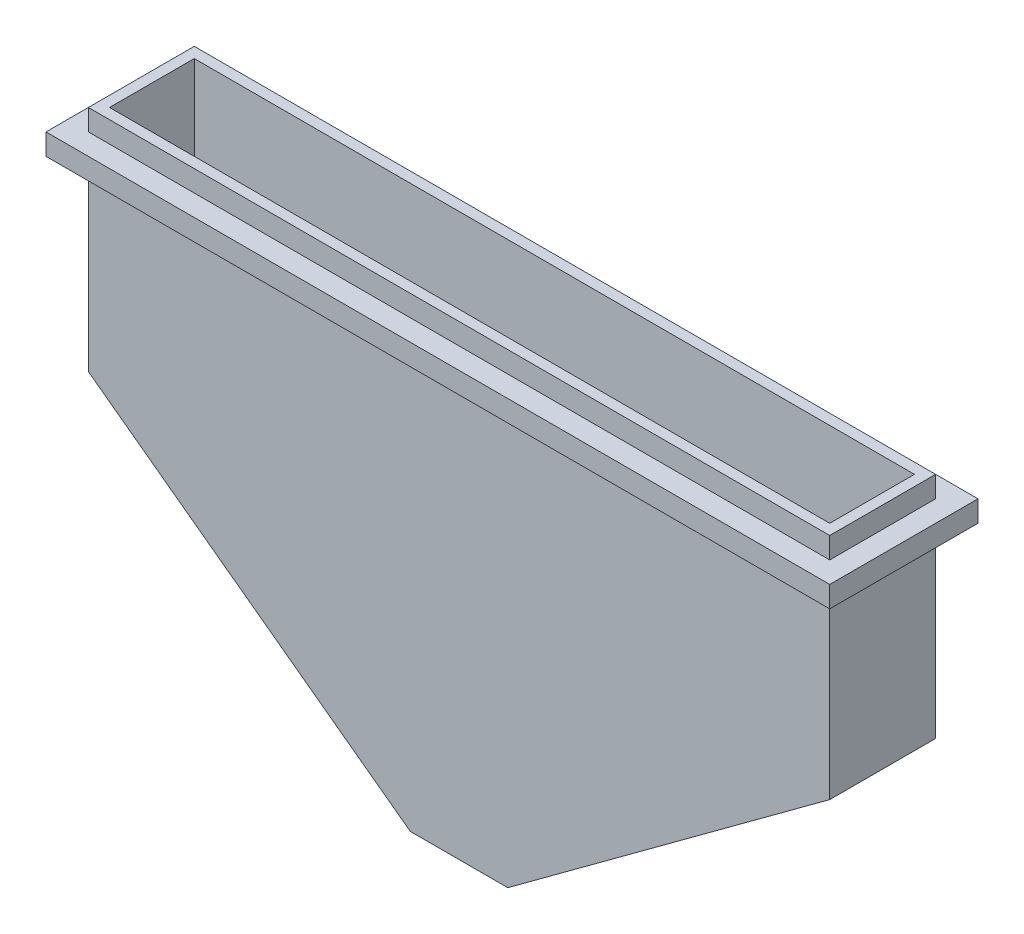
ISO-10303-21;
HEADER;
FILE_DESCRIPTION(('STEP AP214'),'2;1');
FILE_NAME('part.step','',(''),(''),'','','');
FILE_SCHEMA(('AUTOMOTIVE_DESIGN { 1 0 10303 214 1 1 1 1 }'));
ENDSEC;
DATA;
#1=APPLICATION_CONTEXT('core data for automotive mechanical design processes');
#2=APPLICATION_PROTOCOL_DEFINITION('international standard','automotive_design',2000,#1);
#3=PRODUCT_CONTEXT('',#1,'mechanical');
#4=PRODUCT('Part','Part','',(#3));
#5=PRODUCT_RELATED_PRODUCT_CATEGORY('part','',(#4));
#6=PRODUCT_DEFINITION_FORMATION('','',#4);
#7=PRODUCT_DEFINITION_CONTEXT('part definition',#1,'design');
#8=PRODUCT_DEFINITION('design','',#6,#7);
#9=PRODUCT_DEFINITION_SHAPE('','',#8);
#10=(LENGTH_UNIT() NAMED_UNIT(*) SI_UNIT(.MILLI.,.METRE.));
#11=(NAMED_UNIT(*) PLANE_ANGLE_UNIT() SI_UNIT($,.RADIAN.));
#12=(NAMED_UNIT(*) SI_UNIT($,.STERADIAN.) SOLID_ANGLE_UNIT());
#13=UNCERTAINTY_MEASURE_WITH_UNIT(LENGTH_MEASURE(1.E-05),#10,'distance_accuracy_value','');
#14=(GEOMETRIC_REPRESENTATION_CONTEXT(3) GLOBAL_UNCERTAINTY_ASSIGNED_CONTEXT((#13)) GLOBAL_UNIT_ASSIGNED_CONTEXT((#10,
#11,#12)) REPRESENTATION_CONTEXT('',''));
#15=CARTESIAN_POINT('',(0.,0.,0.));
#16=DIRECTION('',(0.,0.,1.));
#17=DIRECTION('',(1.,0.,0.));
#18=AXIS2_PLACEMENT_3D('',#15,#16,#17);
#19=CARTESIAN_POINT('',(0.,0.,0.));
#20=DIRECTION('',(0.,1.,0.));
#21=DIRECTION('',(0.,0.,1.));
#22=AXIS2_PLACEMENT_3D('',#19,#20,#21);
#23=PLANE('',#22);
#24=DIRECTION('',(0.,0.,-1.));
#25=VECTOR('',#24,1.);
#26=CARTESIAN_POINT('',(185.,0.,-35.));
#27=LINE('',#26,#25);
#28=CARTESIAN_POINT('',(185.,0.,35.));
#29=VERTEX_POINT('',#28);
#30=CARTESIAN_POINT('',(185.,0.,-35.));
#31=VERTEX_POINT('',#30);
#32=EDGE_CURVE('E277',#29,#31,#27,.T.);
#33=ORIENTED_EDGE('',*,*,#32,.F.);
#34=DIRECTION('',(1.,0.,0.));
#35=VECTOR('',#34,1.);
#36=CARTESIAN_POINT('',(-185.,0.,35.));
#37=LINE('',#36,#35);
#38=CARTESIAN_POINT('',(-185.,0.,35.));
#39=VERTEX_POINT('',#38);
#40=EDGE_CURVE('E282',#39,#29,#37,.T.);
#41=ORIENTED_EDGE('',*,*,#40,.F.);
#42=DIRECTION('',(0.,0.,1.));
#43=VECTOR('',#42,1.);
#44=CARTESIAN_POINT('',(-185.,0.,-35.));
#45=LINE('',#44,#43);
#46=CARTESIAN_POINT('',(-185.,0.,-35.));
#47=VERTEX_POINT('',#46);
#48=EDGE_CURVE('E293',#47,#39,#45,.T.);
#49=ORIENTED_EDGE('',*,*,#48,.F.);
#50=DIRECTION('',(-1.,0.,0.));
#51=VECTOR('',#50,1.);
#52=CARTESIAN_POINT('',(-185.,0.,-35.));
#53=LINE('',#52,#51);
#54=EDGE_CURVE('E291',#31,#47,#53,.T.);
#55=ORIENTED_EDGE('',*,*,#54,.F.);
#56=EDGE_LOOP('',(#33,#41,#49,#55));
#57=FACE_BOUND('',#56,.T.);
#58=DIRECTION('',(0.,0.,-1.));
#59=VECTOR('',#58,1.);
#60=CARTESIAN_POINT('',(-175.,0.,25.));
#61=LINE('',#60,#59);
#62=CARTESIAN_POINT('',(-175.,0.,25.));
#63=VERTEX_POINT('',#62);
#64=CARTESIAN_POINT('',(-175.,0.,-25.));
#65=VERTEX_POINT('',#64);
#66=EDGE_CURVE('E192',#63,#65,#61,.T.);
#67=ORIENTED_EDGE('',*,*,#66,.F.);
#68=DIRECTION('',(-1.,0.,0.));
#69=VECTOR('',#68,1.);
#70=CARTESIAN_POINT('',(175.,0.,25.));
#71=LINE('',#70,#69);
#72=CARTESIAN_POINT('',(175.,0.,25.));
#73=VERTEX_POINT('',#72);
#74=EDGE_CURVE('E223',#73,#63,#71,.T.);
#75=ORIENTED_EDGE('',*,*,#74,.F.);
#76=DIRECTION('',(0.,0.,1.));
#77=VECTOR('',#76,1.);
#78=CARTESIAN_POINT('',(175.,0.,-25.));
#79=LINE('',#78,#77);
#80=CARTESIAN_POINT('',(175.,0.,-25.));
#81=VERTEX_POINT('',#80);
#82=EDGE_CURVE('E232',#81,#73,#79,.T.);
#83=ORIENTED_EDGE('',*,*,#82,.F.);
#84=DIRECTION('',(1.,0.,0.));
#85=VECTOR('',#84,1.);
#86=CARTESIAN_POINT('',(-175.,0.,-25.));
#87=LINE('',#86,#85);
#88=EDGE_CURVE('E229',#65,#81,#87,.T.);
#89=ORIENTED_EDGE('',*,*,#88,.F.);
#90=EDGE_LOOP('',(#67,#75,#83,#89));
#91=FACE_BOUND('',#90,.T.);
#92=ADVANCED_FACE('F38',(#57,#91),#23,.F.);
#93=CARTESIAN_POINT('',(185.,10.,-35.));
#94=DIRECTION('',(-1.,0.,0.));
#95=DIRECTION('',(0.,0.,1.));
#96=AXIS2_PLACEMENT_3D('',#93,#94,#95);
#97=PLANE('',#96);
#98=ORIENTED_EDGE('',*,*,#32,.T.);
#99=DIRECTION('',(0.,-1.,0.));
#100=VECTOR('',#99,1.);
#101=CARTESIAN_POINT('',(185.,10.,-35.));
#102=LINE('',#101,#100);
#103=CARTESIAN_POINT('',(185.,10.,-35.));
#104=VERTEX_POINT('',#103);
#105=EDGE_CURVE('E304',#104,#31,#102,.T.);
#106=ORIENTED_EDGE('',*,*,#105,.F.);
#107=DIRECTION('',(0.,0.,-1.));
#108=VECTOR('',#107,1.);
#109=CARTESIAN_POINT('',(185.,10.,-35.));
#110=LINE('',#109,#108);
#111=CARTESIAN_POINT('',(185.,10.,35.));
#112=VERTEX_POINT('',#111);
#113=EDGE_CURVE('E278',#112,#104,#110,.T.);
#114=ORIENTED_EDGE('',*,*,#113,.F.);
#115=DIRECTION('',(0.,-1.,0.));
#116=VECTOR('',#115,1.);
#117=CARTESIAN_POINT('',(185.,10.,35.));
#118=LINE('',#117,#116);
#119=EDGE_CURVE('E288',#112,#29,#118,.T.);
#120=ORIENTED_EDGE('',*,*,#119,.T.);
#121=EDGE_LOOP('',(#98,#106,#114,#120));
#122=FACE_BOUND('',#121,.T.);
#123=ADVANCED_FACE('F357',(#122),#97,.F.);
#124=CARTESIAN_POINT('',(-185.,10.,-35.));
#125=DIRECTION('',(0.,0.,1.));
#126=DIRECTION('',(1.,0.,0.));
#127=AXIS2_PLACEMENT_3D('',#124,#125,#126);
#128=PLANE('',#127);
#129=ORIENTED_EDGE('',*,*,#54,.T.);
#130=DIRECTION('',(0.,-1.,0.));
#131=VECTOR('',#130,1.);
#132=CARTESIAN_POINT('',(-185.,10.,-35.));
#133=LINE('',#132,#131);
#134=CARTESIAN_POINT('',(-185.,10.,-35.));
#135=VERTEX_POINT('',#134);
#136=EDGE_CURVE('E301',#135,#47,#133,.T.);
#137=ORIENTED_EDGE('',*,*,#136,.F.);
#138=DIRECTION('',(-1.,0.,0.));
#139=VECTOR('',#138,1.);
#140=CARTESIAN_POINT('',(-185.,10.,-35.));
#141=LINE('',#140,#139);
#142=EDGE_CURVE('E281',#104,#135,#141,.T.);
#143=ORIENTED_EDGE('',*,*,#142,.F.);
#144=ORIENTED_EDGE('',*,*,#105,.T.);
#145=EDGE_LOOP('',(#129,#137,#143,#144));
#146=FACE_BOUND('',#145,.T.);
#147=ADVANCED_FACE('F363',(#146),#128,.F.);
#148=CARTESIAN_POINT('',(-185.,10.,-35.));
#149=DIRECTION('',(1.,0.,0.));
#150=DIRECTION('',(0.,0.,-1.));
#151=AXIS2_PLACEMENT_3D('',#148,#149,#150);
#152=PLANE('',#151);
#153=ORIENTED_EDGE('',*,*,#48,.T.);
#154=DIRECTION('',(0.,-1.,0.));
#155=VECTOR('',#154,1.);
#156=CARTESIAN_POINT('',(-185.,10.,35.));
#157=LINE('',#156,#155);
#158=CARTESIAN_POINT('',(-185.,10.,35.));
#159=VERTEX_POINT('',#158);
#160=EDGE_CURVE('E298',#159,#39,#157,.T.);
#161=ORIENTED_EDGE('',*,*,#160,.F.);
#162=DIRECTION('',(0.,0.,1.));
#163=VECTOR('',#162,1.);
#164=CARTESIAN_POINT('',(-185.,10.,-35.));
#165=LINE('',#164,#163);
#166=EDGE_CURVE('E284',#135,#159,#165,.T.);
#167=ORIENTED_EDGE('',*,*,#166,.F.);
#168=ORIENTED_EDGE('',*,*,#136,.T.);
#169=EDGE_LOOP('',(#153,#161,#167,#168));
#170=FACE_BOUND('',#169,.T.);
#171=ADVANCED_FACE('F374',(#170),#152,.F.);
#172=CARTESIAN_POINT('',(-185.,10.,35.));
#173=DIRECTION('',(0.,0.,-1.));
#174=DIRECTION('',(-1.,0.,0.));
#175=AXIS2_PLACEMENT_3D('',#172,#173,#174);
#176=PLANE('',#175);
#177=ORIENTED_EDGE('',*,*,#40,.T.);
#178=ORIENTED_EDGE('',*,*,#119,.F.);
#179=DIRECTION('',(1.,0.,0.));
#180=VECTOR('',#179,1.);
#181=CARTESIAN_POINT('',(-185.,10.,35.));
#182=LINE('',#181,#180);
#183=EDGE_CURVE('E286',#159,#112,#182,.T.);
#184=ORIENTED_EDGE('',*,*,#183,.F.);
#185=ORIENTED_EDGE('',*,*,#160,.T.);
#186=EDGE_LOOP('',(#177,#178,#184,#185));
#187=FACE_BOUND('',#186,.T.);
#188=ADVANCED_FACE('F371',(#187),#176,.F.);
#189=CARTESIAN_POINT('',(0.,10.,0.));
#190=DIRECTION('',(0.,1.,0.));
#191=DIRECTION('',(0.,0.,1.));
#192=AXIS2_PLACEMENT_3D('',#189,#190,#191);
#193=PLANE('',#192);
#194=DIRECTION('',(0.,0.,-1.));
#195=VECTOR('',#194,1.);
#196=CARTESIAN_POINT('',(175.,10.,-25.));
#197=LINE('',#196,#195);
#198=CARTESIAN_POINT('',(175.,10.,25.));
#199=VERTEX_POINT('',#198);
#200=CARTESIAN_POINT('',(175.,10.,-25.));
#201=VERTEX_POINT('',#200);
#202=EDGE_CURVE('E244',#199,#201,#197,.T.);
#203=ORIENTED_EDGE('',*,*,#202,.F.);
#204=DIRECTION('',(1.,0.,0.));
#205=VECTOR('',#204,1.);
#206=CARTESIAN_POINT('',(-175.,10.,25.));
#207=LINE('',#206,#205);
#208=CARTESIAN_POINT('',(-175.,10.,25.));
#209=VERTEX_POINT('',#208);
#210=EDGE_CURVE('E249',#209,#199,#207,.T.);
#211=ORIENTED_EDGE('',*,*,#210,.F.);
#212=DIRECTION('',(0.,0.,1.));
#213=VECTOR('',#212,1.);
#214=CARTESIAN_POINT('',(-175.,10.,-25.));
#215=LINE('',#214,#213);
#216=CARTESIAN_POINT('',(-175.,10.,-25.));
#217=VERTEX_POINT('',#216);
#218=EDGE_CURVE('E261',#217,#209,#215,.T.);
#219=ORIENTED_EDGE('',*,*,#218,.F.);
#220=DIRECTION('',(-1.,0.,0.));
#221=VECTOR('',#220,1.);
#222=CARTESIAN_POINT('',(-175.,10.,-25.));
#223=LINE('',#222,#221);
#224=EDGE_CURVE('E258',#201,#217,#223,.T.);
#225=ORIENTED_EDGE('',*,*,#224,.F.);
#226=EDGE_LOOP('',(#203,#211,#219,#225));
#227=FACE_BOUND('',#226,.T.);
#228=ORIENTED_EDGE('',*,*,#113,.T.);
#229=ORIENTED_EDGE('',*,*,#142,.T.);
#230=ORIENTED_EDGE('',*,*,#166,.T.);
#231=ORIENTED_EDGE('',*,*,#183,.T.);
#232=EDGE_LOOP('',(#228,#229,#230,#231));
#233=FACE_BOUND('',#232,.T.);
#234=ADVANCED_FACE('F369',(#227,#233),#193,.T.);
#235=CARTESIAN_POINT('',(175.,20.,-25.));
#236=DIRECTION('',(-1.,0.,0.));
#237=DIRECTION('',(0.,0.,1.));
#238=AXIS2_PLACEMENT_3D('',#235,#236,#237);
#239=PLANE('',#238);
#240=ORIENTED_EDGE('',*,*,#202,.T.);
#241=DIRECTION('',(0.,-1.,0.));
#242=VECTOR('',#241,1.);
#243=CARTESIAN_POINT('',(175.,20.,-25.));
#244=LINE('',#243,#242);
#245=CARTESIAN_POINT('',(175.,20.,-25.));
#246=VERTEX_POINT('',#245);
#247=EDGE_CURVE('E274',#246,#201,#244,.T.);
#248=ORIENTED_EDGE('',*,*,#247,.F.);
#249=DIRECTION('',(0.,0.,-1.));
#250=VECTOR('',#249,1.);
#251=CARTESIAN_POINT('',(175.,20.,-25.));
#252=LINE('',#251,#250);
#253=CARTESIAN_POINT('',(175.,20.,25.));
#254=VERTEX_POINT('',#253);
#255=EDGE_CURVE('E245',#254,#246,#252,.T.);
#256=ORIENTED_EDGE('',*,*,#255,.F.);
#257=DIRECTION('',(0.,-1.,0.));
#258=VECTOR('',#257,1.);
#259=CARTESIAN_POINT('',(175.,20.,25.));
#260=LINE('',#259,#258);
#261=EDGE_CURVE('E255',#254,#199,#260,.T.);
#262=ORIENTED_EDGE('',*,*,#261,.T.);
#263=EDGE_LOOP('',(#240,#248,#256,#262));
#264=FACE_BOUND('',#263,.T.);
#265=ADVANCED_FACE('F399',(#264),#239,.F.);
#266=CARTESIAN_POINT('',(-175.,20.,-25.));
#267=DIRECTION('',(0.,0.,1.));
#268=DIRECTION('',(1.,0.,0.));
#269=AXIS2_PLACEMENT_3D('',#266,#267,#268);
#270=PLANE('',#269);
#271=ORIENTED_EDGE('',*,*,#224,.T.);
#272=DIRECTION('',(0.,-1.,0.));
#273=VECTOR('',#272,1.);
#274=CARTESIAN_POINT('',(-175.,20.,-25.));
#275=LINE('',#274,#273);
#276=CARTESIAN_POINT('',(-175.,20.,-25.));
#277=VERTEX_POINT('',#276);
#278=EDGE_CURVE('E271',#277,#217,#275,.T.);
#279=ORIENTED_EDGE('',*,*,#278,.F.);
#280=DIRECTION('',(-1.,0.,0.));
#281=VECTOR('',#280,1.);
#282=CARTESIAN_POINT('',(-175.,20.,-25.));
#283=LINE('',#282,#281);
#284=EDGE_CURVE('E248',#246,#277,#283,.T.);
#285=ORIENTED_EDGE('',*,*,#284,.F.);
#286=ORIENTED_EDGE('',*,*,#247,.T.);
#287=EDGE_LOOP('',(#271,#279,#285,#286));
#288=FACE_BOUND('',#287,.T.);
#289=ADVANCED_FACE('F404',(#288),#270,.F.);
#290=CARTESIAN_POINT('',(-175.,20.,-25.));
#291=DIRECTION('',(1.,0.,0.));
#292=DIRECTION('',(0.,0.,-1.));
#293=AXIS2_PLACEMENT_3D('',#290,#291,#292);
#294=PLANE('',#293);
#295=ORIENTED_EDGE('',*,*,#218,.T.);
#296=DIRECTION('',(0.,-1.,0.));
#297=VECTOR('',#296,1.);
#298=CARTESIAN_POINT('',(-175.,20.,25.));
#299=LINE('',#298,#297);
#300=CARTESIAN_POINT('',(-175.,20.,25.));
#301=VERTEX_POINT('',#300);
#302=EDGE_CURVE('E268',#301,#209,#299,.T.);
#303=ORIENTED_EDGE('',*,*,#302,.F.);
#304=DIRECTION('',(0.,0.,1.));
#305=VECTOR('',#304,1.);
#306=CARTESIAN_POINT('',(-175.,20.,-25.));
#307=LINE('',#306,#305);
#308=EDGE_CURVE('E251',#277,#301,#307,.T.);
#309=ORIENTED_EDGE('',*,*,#308,.F.);
#310=ORIENTED_EDGE('',*,*,#278,.T.);
#311=EDGE_LOOP('',(#295,#303,#309,#310));
#312=FACE_BOUND('',#311,.T.);
#313=ADVANCED_FACE('F418',(#312),#294,.F.);
#314=CARTESIAN_POINT('',(-175.,20.,25.));
#315=DIRECTION('',(0.,0.,-1.));
#316=DIRECTION('',(-1.,0.,0.));
#317=AXIS2_PLACEMENT_3D('',#314,#315,#316);
#318=PLANE('',#317);
#319=ORIENTED_EDGE('',*,*,#210,.T.);
#320=ORIENTED_EDGE('',*,*,#261,.F.);
#321=DIRECTION('',(1.,0.,0.));
#322=VECTOR('',#321,1.);
#323=CARTESIAN_POINT('',(-175.,20.,25.));
#324=LINE('',#323,#322);
#325=EDGE_CURVE('E253',#301,#254,#324,.T.);
#326=ORIENTED_EDGE('',*,*,#325,.F.);
#327=ORIENTED_EDGE('',*,*,#302,.T.);
#328=EDGE_LOOP('',(#319,#320,#326,#327));
#329=FACE_BOUND('',#328,.T.);
#330=ADVANCED_FACE('F409',(#329),#318,.F.);
#331=CARTESIAN_POINT('',(0.,20.,0.));
#332=DIRECTION('',(0.,1.,0.));
#333=DIRECTION('',(0.,0.,1.));
#334=AXIS2_PLACEMENT_3D('',#331,#332,#333);
#335=PLANE('',#334);
#336=DIRECTION('',(0.,0.,-1.));
#337=VECTOR('',#336,1.);
#338=CARTESIAN_POINT('',(170.,20.,-25.));
#339=LINE('',#338,#337);
#340=CARTESIAN_POINT('',(170.,20.,20.));
#341=VERTEX_POINT('',#340);
#342=CARTESIAN_POINT('',(170.,20.,-20.));
#343=VERTEX_POINT('',#342);
#344=EDGE_CURVE('E212',#341,#343,#339,.T.);
#345=ORIENTED_EDGE('',*,*,#344,.F.);
#346=DIRECTION('',(1.,0.,0.));
#347=VECTOR('',#346,1.);
#348=CARTESIAN_POINT('',(-175.,20.,20.));
#349=LINE('',#348,#347);
#350=CARTESIAN_POINT('',(-170.,20.,20.));
#351=VERTEX_POINT('',#350);
#352=EDGE_CURVE('E217',#351,#341,#349,.T.);
#353=ORIENTED_EDGE('',*,*,#352,.F.);
#354=DIRECTION('',(0.,0.,1.));
#355=VECTOR('',#354,1.);
#356=CARTESIAN_POINT('',(-170.,20.,-25.));
#357=LINE('',#356,#355);
#358=CARTESIAN_POINT('',(-170.,20.,-20.));
#359=VERTEX_POINT('',#358);
#360=EDGE_CURVE('E180',#359,#351,#357,.T.);
#361=ORIENTED_EDGE('',*,*,#360,.F.);
#362=DIRECTION('',(-1.,0.,0.));
#363=VECTOR('',#362,1.);
#364=CARTESIAN_POINT('',(-175.,20.,-20.));
#365=LINE('',#364,#363);
#366=EDGE_CURVE('E214',#343,#359,#365,.T.);
#367=ORIENTED_EDGE('',*,*,#366,.F.);
#368=EDGE_LOOP('',(#345,#353,#361,#367));
#369=FACE_BOUND('',#368,.T.);
#370=ORIENTED_EDGE('',*,*,#255,.T.);
#371=ORIENTED_EDGE('',*,*,#284,.T.);
#372=ORIENTED_EDGE('',*,*,#308,.T.);
#373=ORIENTED_EDGE('',*,*,#325,.T.);
#374=EDGE_LOOP('',(#370,#371,#372,#373));
#375=FACE_BOUND('',#374,.T.);
#376=ADVANCED_FACE('F414',(#369,#375),#335,.T.);
#377=CARTESIAN_POINT('',(-175.,-200.,25.));
#378=DIRECTION('',(1.,0.,0.));
#379=DIRECTION('',(0.,0.,-1.));
#380=AXIS2_PLACEMENT_3D('',#377,#378,#379);
#381=PLANE('',#380);
#382=DIRECTION('',(0.,1.,0.));
#383=VECTOR('',#382,1.);
#384=CARTESIAN_POINT('',(-175.,-200.,-25.));
#385=LINE('',#384,#383);
#386=CARTESIAN_POINT('',(-175.,-87.9999999999997,-25.));
#387=VERTEX_POINT('',#386);
#388=EDGE_CURVE('E242',#387,#65,#385,.T.);
#389=ORIENTED_EDGE('',*,*,#388,.F.);
#390=DIRECTION('',(0.,0.,1.));
#391=VECTOR('',#390,1.);
#392=CARTESIAN_POINT('',(-175.,-87.9999999999997,25.));
#393=LINE('',#392,#391);
#394=CARTESIAN_POINT('',(-175.,-87.9999999999997,25.));
#395=VERTEX_POINT('',#394);
#396=EDGE_CURVE('E11',#387,#395,#393,.T.);
#397=ORIENTED_EDGE('',*,*,#396,.T.);
#398=DIRECTION('',(0.,1.,0.));
#399=VECTOR('',#398,1.);
#400=CARTESIAN_POINT('',(-175.,-200.,25.));
#401=LINE('',#400,#399);
#402=EDGE_CURVE('E226',#395,#63,#401,.T.);
#403=ORIENTED_EDGE('',*,*,#402,.T.);
#404=ORIENTED_EDGE('',*,*,#66,.T.);
#405=EDGE_LOOP('',(#389,#397,#403,#404));
#406=FACE_BOUND('',#405,.T.);
#407=ADVANCED_FACE('F343',(#406),#381,.F.);
#408=CARTESIAN_POINT('',(-175.,-200.,-25.));
#409=DIRECTION('',(0.,0.,1.));
#410=DIRECTION('',(1.,0.,0.));
#411=AXIS2_PLACEMENT_3D('',#408,#409,#410);
#412=PLANE('',#411);
#413=DIRECTION('',(0.,1.,0.));
#414=VECTOR('',#413,1.);
#415=CARTESIAN_POINT('',(175.,-200.,-25.));
#416=LINE('',#415,#414);
#417=CARTESIAN_POINT('',(175.,-87.9999999999997,-25.));
#418=VERTEX_POINT('',#417);
#419=EDGE_CURVE('E240',#418,#81,#416,.T.);
#420=ORIENTED_EDGE('',*,*,#419,.F.);
#421=DIRECTION('',(-0.805055837353368,-0.593199038049849,0.));
#422=VECTOR('',#421,1.);
#423=CARTESIAN_POINT('',(22.9999999999994,-200.,-25.));
#424=LINE('',#423,#422);
#425=CARTESIAN_POINT('',(22.9999999999994,-200.,-25.));
#426=VERTEX_POINT('',#425);
#427=EDGE_CURVE('E48',#418,#426,#424,.T.);
#428=ORIENTED_EDGE('',*,*,#427,.T.);
#429=DIRECTION('',(1.,0.,0.));
#430=VECTOR('',#429,1.);
#431=CARTESIAN_POINT('',(-175.,-200.,-25.));
#432=LINE('',#431,#430);
#433=CARTESIAN_POINT('',(-22.9999999999994,-200.,-25.));
#434=VERTEX_POINT('',#433);
#435=EDGE_CURVE('E219',#434,#426,#432,.T.);
#436=ORIENTED_EDGE('',*,*,#435,.F.);
#437=DIRECTION('',(-0.805055837353368,0.593199038049849,0.));
#438=VECTOR('',#437,1.);
#439=CARTESIAN_POINT('',(-22.9999999999994,-200.,-25.));
#440=LINE('',#439,#438);
#441=EDGE_CURVE('E63',#434,#387,#440,.T.);
#442=ORIENTED_EDGE('',*,*,#441,.T.);
#443=ORIENTED_EDGE('',*,*,#388,.T.);
#444=ORIENTED_EDGE('',*,*,#88,.T.);
#445=EDGE_LOOP('',(#420,#428,#436,#442,#443,#444));
#446=FACE_BOUND('',#445,.T.);
#447=ADVANCED_FACE('F322',(#446),#412,.F.);
#448=CARTESIAN_POINT('',(175.,-200.,-25.));
#449=DIRECTION('',(-1.,0.,0.));
#450=DIRECTION('',(0.,0.,1.));
#451=AXIS2_PLACEMENT_3D('',#448,#449,#450);
#452=PLANE('',#451);
#453=DIRECTION('',(0.,1.,0.));
#454=VECTOR('',#453,1.);
#455=CARTESIAN_POINT('',(175.,-200.,25.));
#456=LINE('',#455,#454);
#457=CARTESIAN_POINT('',(175.,-87.9999999999997,25.));
#458=VERTEX_POINT('',#457);
#459=EDGE_CURVE('E238',#458,#73,#456,.T.);
#460=ORIENTED_EDGE('',*,*,#459,.F.);
#461=DIRECTION('',(0.,0.,-1.));
#462=VECTOR('',#461,1.);
#463=CARTESIAN_POINT('',(175.,-87.9999999999997,-25.));
#464=LINE('',#463,#462);
#465=EDGE_CURVE('E317',#458,#418,#464,.T.);
#466=ORIENTED_EDGE('',*,*,#465,.T.);
#467=ORIENTED_EDGE('',*,*,#419,.T.);
#468=ORIENTED_EDGE('',*,*,#82,.T.);
#469=EDGE_LOOP('',(#460,#466,#467,#468));
#470=FACE_BOUND('',#469,.T.);
#471=ADVANCED_FACE('F336',(#470),#452,.F.);
#472=CARTESIAN_POINT('',(175.,-200.,25.));
#473=DIRECTION('',(0.,0.,-1.));
#474=DIRECTION('',(-1.,0.,0.));
#475=AXIS2_PLACEMENT_3D('',#472,#473,#474);
#476=PLANE('',#475);
#477=DIRECTION('',(-1.,0.,0.));
#478=VECTOR('',#477,1.);
#479=CARTESIAN_POINT('',(175.,-200.,25.));
#480=LINE('',#479,#478);
#481=CARTESIAN_POINT('',(22.9999999999994,-200.,25.));
#482=VERTEX_POINT('',#481);
#483=CARTESIAN_POINT('',(-22.9999999999994,-200.,25.));
#484=VERTEX_POINT('',#483);
#485=EDGE_CURVE('E222',#482,#484,#480,.T.);
#486=ORIENTED_EDGE('',*,*,#485,.F.);
#487=DIRECTION('',(0.805055837353368,0.593199038049849,0.));
#488=VECTOR('',#487,1.);
#489=CARTESIAN_POINT('',(22.9999999999994,-200.,25.));
#490=LINE('',#489,#488);
#491=EDGE_CURVE('E315',#482,#458,#490,.T.);
#492=ORIENTED_EDGE('',*,*,#491,.T.);
#493=ORIENTED_EDGE('',*,*,#459,.T.);
#494=ORIENTED_EDGE('',*,*,#74,.T.);
#495=ORIENTED_EDGE('',*,*,#402,.F.);
#496=DIRECTION('',(0.805055837353368,-0.593199038049849,0.));
#497=VECTOR('',#496,1.);
#498=CARTESIAN_POINT('',(-22.9999999999994,-200.,25.));
#499=LINE('',#498,#497);
#500=EDGE_CURVE('E313',#395,#484,#499,.T.);
#501=ORIENTED_EDGE('',*,*,#500,.T.);
#502=EDGE_LOOP('',(#486,#492,#493,#494,#495,#501));
#503=FACE_BOUND('',#502,.T.);
#504=ADVANCED_FACE('F333',(#503),#476,.F.);
#505=CARTESIAN_POINT('',(0.,-200.,0.));
#506=DIRECTION('',(0.,-1.,0.));
#507=DIRECTION('',(0.,0.,-1.));
#508=AXIS2_PLACEMENT_3D('',#505,#506,#507);
#509=PLANE('',#508);
#510=CARTESIAN_POINT('',(0.,-200.,0.));
#511=DIRECTION('',(0.,-1.,0.));
#512=DIRECTION('',(0.,0.,-1.));
#513=AXIS2_PLACEMENT_3D('',#510,#511,#512);
#514=CIRCLE('',#513,12.5);
#515=CARTESIAN_POINT('',(0.,-200.,-12.5));
#516=VERTEX_POINT('',#515);
#517=EDGE_CURVE('E468',#516,#516,#514,.T.);
#518=ORIENTED_EDGE('',*,*,#517,.F.);
#519=EDGE_LOOP('',(#518));
#520=FACE_BOUND('',#519,.T.);
#521=ORIENTED_EDGE('',*,*,#435,.T.);
#522=DIRECTION('',(0.,0.,1.));
#523=VECTOR('',#522,1.);
#524=CARTESIAN_POINT('',(22.9999999999994,-200.,25.));
#525=LINE('',#524,#523);
#526=EDGE_CURVE('E310',#426,#482,#525,.T.);
#527=ORIENTED_EDGE('',*,*,#526,.T.);
#528=ORIENTED_EDGE('',*,*,#485,.T.);
#529=DIRECTION('',(0.,0.,-1.));
#530=VECTOR('',#529,1.);
#531=CARTESIAN_POINT('',(-22.9999999999994,-200.,-25.));
#532=LINE('',#531,#530);
#533=EDGE_CURVE('E307',#484,#434,#532,.T.);
#534=ORIENTED_EDGE('',*,*,#533,.T.);
#535=EDGE_LOOP('',(#521,#527,#528,#534));
#536=FACE_BOUND('',#535,.T.);
#537=ADVANCED_FACE('F327',(#520,#536),#509,.T.);
#538=CARTESIAN_POINT('',(22.9999999999994,-200.,0.));
#539=DIRECTION('',(0.593199038049849,-0.805055837353368,0.));
#540=DIRECTION('',(0.,0.,-1.));
#541=AXIS2_PLACEMENT_3D('',#538,#539,#540);
#542=PLANE('',#541);
#543=ORIENTED_EDGE('',*,*,#427,.F.);
#544=ORIENTED_EDGE('',*,*,#465,.F.);
#545=ORIENTED_EDGE('',*,*,#491,.F.);
#546=ORIENTED_EDGE('',*,*,#526,.F.);
#547=EDGE_LOOP('',(#543,#544,#545,#546));
#548=FACE_BOUND('',#547,.T.);
#549=ADVANCED_FACE('F330',(#548),#542,.T.);
#550=CARTESIAN_POINT('',(-22.9999999999994,-200.,0.));
#551=DIRECTION('',(-0.593199038049849,-0.805055837353368,0.));
#552=DIRECTION('',(0.,0.,1.));
#553=AXIS2_PLACEMENT_3D('',#550,#551,#552);
#554=PLANE('',#553);
#555=ORIENTED_EDGE('',*,*,#500,.F.);
#556=ORIENTED_EDGE('',*,*,#396,.F.);
#557=ORIENTED_EDGE('',*,*,#441,.F.);
#558=ORIENTED_EDGE('',*,*,#533,.F.);
#559=EDGE_LOOP('',(#555,#556,#557,#558));
#560=FACE_BOUND('',#559,.T.);
#561=ADVANCED_FACE('F41',(#560),#554,.T.);
#562=CARTESIAN_POINT('',(170.,20.,-25.));
#563=DIRECTION('',(-1.,0.,0.));
#564=DIRECTION('',(0.,0.,1.));
#565=AXIS2_PLACEMENT_3D('',#562,#563,#564);
#566=PLANE('',#565);
#567=DIRECTION('',(0.,-1.,0.));
#568=VECTOR('',#567,1.);
#569=CARTESIAN_POINT('',(170.,20.,20.));
#570=LINE('',#569,#568);
#571=CARTESIAN_POINT('',(170.,-85.473461199365,20.));
#572=VERTEX_POINT('',#571);
#573=EDGE_CURVE('E183',#341,#572,#570,.T.);
#574=ORIENTED_EDGE('',*,*,#573,.F.);
#575=ORIENTED_EDGE('',*,*,#344,.T.);
#576=DIRECTION('',(0.,-1.,0.));
#577=VECTOR('',#576,1.);
#578=CARTESIAN_POINT('',(170.,20.,-20.));
#579=LINE('',#578,#577);
#580=CARTESIAN_POINT('',(170.,-85.473461199365,-20.));
#581=VERTEX_POINT('',#580);
#582=EDGE_CURVE('E211',#343,#581,#579,.T.);
#583=ORIENTED_EDGE('',*,*,#582,.T.);
#584=DIRECTION('',(0.,0.,-1.));
#585=VECTOR('',#584,1.);
#586=CARTESIAN_POINT('',(170.,-85.473461199365,0.));
#587=LINE('',#586,#585);
#588=EDGE_CURVE('E203',#572,#581,#587,.T.);
#589=ORIENTED_EDGE('',*,*,#588,.F.);
#590=EDGE_LOOP('',(#574,#575,#583,#589));
#591=FACE_BOUND('',#590,.T.);
#592=ADVANCED_FACE('F348',(#591),#566,.T.);
#593=CARTESIAN_POINT('',(-175.,20.,-20.));
#594=DIRECTION('',(0.,0.,1.));
#595=DIRECTION('',(1.,0.,0.));
#596=AXIS2_PLACEMENT_3D('',#593,#594,#595);
#597=PLANE('',#596);
#598=ORIENTED_EDGE('',*,*,#582,.F.);
#599=ORIENTED_EDGE('',*,*,#366,.T.);
#600=DIRECTION('',(0.,-1.,0.));
#601=VECTOR('',#600,1.);
#602=CARTESIAN_POINT('',(-170.,20.,-20.));
#603=LINE('',#602,#601);
#604=CARTESIAN_POINT('',(-170.,-85.473461199365,-20.));
#605=VERTEX_POINT('',#604);
#606=EDGE_CURVE('E182',#359,#605,#603,.T.);
#607=ORIENTED_EDGE('',*,*,#606,.T.);
#608=DIRECTION('',(-0.805055837353368,0.593199038049849,0.));
#609=VECTOR('',#608,1.);
#610=CARTESIAN_POINT('',(-20.0340048097501,-195.974720813233,-20.));
#611=LINE('',#610,#609);
#612=CARTESIAN_POINT('',(-21.356840199138,-195.,-20.));
#613=VERTEX_POINT('',#612);
#614=EDGE_CURVE('E191',#613,#605,#611,.T.);
#615=ORIENTED_EDGE('',*,*,#614,.F.);
#616=DIRECTION('',(1.,0.,0.));
#617=VECTOR('',#616,1.);
#618=CARTESIAN_POINT('',(-175.,-195.,-20.));
#619=LINE('',#618,#617);
#620=CARTESIAN_POINT('',(21.356840199138,-195.,-20.));
#621=VERTEX_POINT('',#620);
#622=EDGE_CURVE('E471',#613,#621,#619,.T.);
#623=ORIENTED_EDGE('',*,*,#622,.T.);
#624=DIRECTION('',(-0.805055837353368,-0.593199038049849,0.));
#625=VECTOR('',#624,1.);
#626=CARTESIAN_POINT('',(20.0340048097501,-195.974720813233,-20.));
#627=LINE('',#626,#625);
#628=EDGE_CURVE('E193',#581,#621,#627,.T.);
#629=ORIENTED_EDGE('',*,*,#628,.F.);
#630=EDGE_LOOP('',(#598,#599,#607,#615,#623,#629));
#631=FACE_BOUND('',#630,.T.);
#632=ADVANCED_FACE('F353',(#631),#597,.T.);
#633=CARTESIAN_POINT('',(-170.,20.,-25.));
#634=DIRECTION('',(1.,0.,0.));
#635=DIRECTION('',(0.,0.,-1.));
#636=AXIS2_PLACEMENT_3D('',#633,#634,#635);
#637=PLANE('',#636);
#638=ORIENTED_EDGE('',*,*,#606,.F.);
#639=ORIENTED_EDGE('',*,*,#360,.T.);
#640=DIRECTION('',(0.,-1.,0.));
#641=VECTOR('',#640,1.);
#642=CARTESIAN_POINT('',(-170.,20.,20.));
#643=LINE('',#642,#641);
#644=CARTESIAN_POINT('',(-170.,-85.473461199365,20.));
#645=VERTEX_POINT('',#644);
#646=EDGE_CURVE('E55',#351,#645,#643,.T.);
#647=ORIENTED_EDGE('',*,*,#646,.T.);
#648=DIRECTION('',(0.,0.,1.));
#649=VECTOR('',#648,1.);
#650=CARTESIAN_POINT('',(-170.,-85.473461199365,0.));
#651=LINE('',#650,#649);
#652=EDGE_CURVE('E178',#605,#645,#651,.T.);
#653=ORIENTED_EDGE('',*,*,#652,.F.);
#654=EDGE_LOOP('',(#638,#639,#647,#653));
#655=FACE_BOUND('',#654,.T.);
#656=ADVANCED_FACE('F177',(#655),#637,.T.);
#657=CARTESIAN_POINT('',(-175.,20.,20.));
#658=DIRECTION('',(0.,0.,-1.));
#659=DIRECTION('',(-1.,0.,0.));
#660=AXIS2_PLACEMENT_3D('',#657,#658,#659);
#661=PLANE('',#660);
#662=ORIENTED_EDGE('',*,*,#646,.F.);
#663=ORIENTED_EDGE('',*,*,#352,.T.);
#664=ORIENTED_EDGE('',*,*,#573,.T.);
#665=DIRECTION('',(0.805055837353368,0.593199038049849,0.));
#666=VECTOR('',#665,1.);
#667=CARTESIAN_POINT('',(20.0340048097501,-195.974720813233,20.));
#668=LINE('',#667,#666);
#669=CARTESIAN_POINT('',(21.356840199138,-195.,20.));
#670=VERTEX_POINT('',#669);
#671=EDGE_CURVE('E199',#670,#572,#668,.T.);
#672=ORIENTED_EDGE('',*,*,#671,.F.);
#673=DIRECTION('',(-1.,0.,0.));
#674=VECTOR('',#673,1.);
#675=CARTESIAN_POINT('',(175.,-195.,20.));
#676=LINE('',#675,#674);
#677=CARTESIAN_POINT('',(-21.356840199138,-195.,20.));
#678=VERTEX_POINT('',#677);
#679=EDGE_CURVE('E197',#670,#678,#676,.T.);
#680=ORIENTED_EDGE('',*,*,#679,.T.);
#681=DIRECTION('',(0.805055837353368,-0.593199038049849,0.));
#682=VECTOR('',#681,1.);
#683=CARTESIAN_POINT('',(-20.0340048097501,-195.974720813233,20.));
#684=LINE('',#683,#682);
#685=EDGE_CURVE('E189',#645,#678,#684,.T.);
#686=ORIENTED_EDGE('',*,*,#685,.F.);
#687=EDGE_LOOP('',(#662,#663,#664,#672,#680,#686));
#688=FACE_BOUND('',#687,.T.);
#689=ADVANCED_FACE('F195',(#688),#661,.T.);
#690=CARTESIAN_POINT('',(0.,-195.,0.));
#691=DIRECTION('',(0.,-1.,0.));
#692=DIRECTION('',(0.,0.,-1.));
#693=AXIS2_PLACEMENT_3D('',#690,#691,#692);
#694=PLANE('',#693);
#695=CARTESIAN_POINT('',(0.,-195.,0.));
#696=DIRECTION('',(0.,-1.,0.));
#697=DIRECTION('',(0.,0.,-1.));
#698=AXIS2_PLACEMENT_3D('',#695,#696,#697);
#699=CIRCLE('',#698,12.5);
#700=CARTESIAN_POINT('',(0.,-195.,-12.5));
#701=VERTEX_POINT('',#700);
#702=EDGE_CURVE('E43',#701,#701,#699,.T.);
#703=ORIENTED_EDGE('',*,*,#702,.T.);
#704=EDGE_LOOP('',(#703));
#705=FACE_BOUND('',#704,.T.);
#706=ORIENTED_EDGE('',*,*,#622,.F.);
#707=DIRECTION('',(0.,0.,-1.));
#708=VECTOR('',#707,1.);
#709=CARTESIAN_POINT('',(-21.356840199138,-195.,0.));
#710=LINE('',#709,#708);
#711=EDGE_CURVE('E206',#678,#613,#710,.T.);
#712=ORIENTED_EDGE('',*,*,#711,.F.);
#713=ORIENTED_EDGE('',*,*,#679,.F.);
#714=DIRECTION('',(0.,0.,1.));
#715=VECTOR('',#714,1.);
#716=CARTESIAN_POINT('',(21.356840199138,-195.,0.));
#717=LINE('',#716,#715);
#718=EDGE_CURVE('E200',#621,#670,#717,.T.);
#719=ORIENTED_EDGE('',*,*,#718,.F.);
#720=EDGE_LOOP('',(#706,#712,#713,#719));
#721=FACE_BOUND('',#720,.T.);
#722=ADVANCED_FACE('F449',(#705,#721),#694,.F.);
#723=CARTESIAN_POINT('',(20.0340048097501,-195.974720813233,0.));
#724=DIRECTION('',(0.593199038049849,-0.805055837353368,0.));
#725=DIRECTION('',(0.,0.,-1.));
#726=AXIS2_PLACEMENT_3D('',#723,#724,#725);
#727=PLANE('',#726);
#728=ORIENTED_EDGE('',*,*,#628,.T.);
#729=ORIENTED_EDGE('',*,*,#718,.T.);
#730=ORIENTED_EDGE('',*,*,#671,.T.);
#731=ORIENTED_EDGE('',*,*,#588,.T.);
#732=EDGE_LOOP('',(#728,#729,#730,#731));
#733=FACE_BOUND('',#732,.T.);
#734=ADVANCED_FACE('F446',(#733),#727,.F.);
#735=CARTESIAN_POINT('',(-20.0340048097501,-195.974720813233,0.));
#736=DIRECTION('',(-0.593199038049849,-0.805055837353368,0.));
#737=DIRECTION('',(0.,0.,1.));
#738=AXIS2_PLACEMENT_3D('',#735,#736,#737);
#739=PLANE('',#738);
#740=ORIENTED_EDGE('',*,*,#685,.T.);
#741=ORIENTED_EDGE('',*,*,#711,.T.);
#742=ORIENTED_EDGE('',*,*,#614,.T.);
#743=ORIENTED_EDGE('',*,*,#652,.T.);
#744=EDGE_LOOP('',(#740,#741,#742,#743));
#745=FACE_BOUND('',#744,.T.);
#746=ADVANCED_FACE('F187',(#745),#739,.F.);
#747=CARTESIAN_POINT('',(0.,-170.,0.));
#748=DIRECTION('',(0.,-1.,0.));
#749=DIRECTION('',(0.,0.,-1.));
#750=AXIS2_PLACEMENT_3D('',#747,#748,#749);
#751=CYLINDRICAL_SURFACE('',#750,12.5);
#752=CARTESIAN_POINT('',(0.,-200.,-12.5));
#753=CARTESIAN_POINT('',(0.,-199.947916666667,-12.5));
#754=CARTESIAN_POINT('',(0.,-199.895833333333,-12.5));
#755=CARTESIAN_POINT('',(0.,-199.791666666667,-12.5));
#756=CARTESIAN_POINT('',(0.,-199.739583333333,-12.5));
#757=CARTESIAN_POINT('',(0.,-199.635416666667,-12.5));
#758=CARTESIAN_POINT('',(0.,-199.583333333333,-12.5));
#759=CARTESIAN_POINT('',(0.,-199.479166666667,-12.5));
#760=CARTESIAN_POINT('',(0.,-199.427083333333,-12.5));
#761=CARTESIAN_POINT('',(0.,-199.322916666667,-12.5));
#762=CARTESIAN_POINT('',(0.,-199.270833333333,-12.5));
#763=CARTESIAN_POINT('',(0.,-199.166666666667,-12.5));
#764=CARTESIAN_POINT('',(0.,-199.114583333333,-12.5));
#765=CARTESIAN_POINT('',(0.,-199.010416666667,-12.5));
#766=CARTESIAN_POINT('',(0.,-198.958333333333,-12.5));
#767=CARTESIAN_POINT('',(0.,-198.854166666667,-12.5));
#768=CARTESIAN_POINT('',(0.,-198.802083333333,-12.5));
#769=CARTESIAN_POINT('',(0.,-198.697916666667,-12.5));
#770=CARTESIAN_POINT('',(0.,-198.645833333333,-12.5));
#771=CARTESIAN_POINT('',(0.,-198.541666666667,-12.5));
#772=CARTESIAN_POINT('',(0.,-198.489583333333,-12.5));
#773=CARTESIAN_POINT('',(0.,-198.385416666667,-12.5));
#774=CARTESIAN_POINT('',(0.,-198.333333333333,-12.5));
#775=CARTESIAN_POINT('',(0.,-198.229166666667,-12.5));
#776=CARTESIAN_POINT('',(0.,-198.177083333333,-12.5));
#777=CARTESIAN_POINT('',(0.,-198.072916666667,-12.5));
#778=CARTESIAN_POINT('',(0.,-198.020833333333,-12.5));
#779=CARTESIAN_POINT('',(0.,-197.916666666667,-12.5));
#780=CARTESIAN_POINT('',(0.,-197.864583333333,-12.5));
#781=CARTESIAN_POINT('',(0.,-197.760416666667,-12.5));
#782=CARTESIAN_POINT('',(0.,-197.708333333333,-12.5));
#783=CARTESIAN_POINT('',(0.,-197.604166666667,-12.5));
#784=CARTESIAN_POINT('',(0.,-197.552083333333,-12.5));
#785=CARTESIAN_POINT('',(0.,-197.447916666667,-12.5));
#786=CARTESIAN_POINT('',(0.,-197.395833333333,-12.5));
#787=CARTESIAN_POINT('',(0.,-197.291666666667,-12.5));
#788=CARTESIAN_POINT('',(0.,-197.239583333333,-12.5));
#789=CARTESIAN_POINT('',(0.,-197.135416666667,-12.5));
#790=CARTESIAN_POINT('',(0.,-197.083333333333,-12.5));
#791=CARTESIAN_POINT('',(0.,-196.979166666667,-12.5));
#792=CARTESIAN_POINT('',(0.,-196.927083333333,-12.5));
#793=CARTESIAN_POINT('',(0.,-196.822916666667,-12.5));
#794=CARTESIAN_POINT('',(0.,-196.770833333333,-12.5));
#795=CARTESIAN_POINT('',(0.,-196.666666666667,-12.5));
#796=CARTESIAN_POINT('',(0.,-196.614583333333,-12.5));
#797=CARTESIAN_POINT('',(0.,-196.510416666667,-12.5));
#798=CARTESIAN_POINT('',(0.,-196.458333333333,-12.5));
#799=CARTESIAN_POINT('',(0.,-196.354166666667,-12.5));
#800=CARTESIAN_POINT('',(0.,-196.302083333333,-12.5));
#801=CARTESIAN_POINT('',(0.,-196.197916666667,-12.5));
#802=CARTESIAN_POINT('',(0.,-196.145833333333,-12.5));
#803=CARTESIAN_POINT('',(0.,-196.041666666667,-12.5));
#804=CARTESIAN_POINT('',(0.,-195.989583333333,-12.5));
#805=CARTESIAN_POINT('',(0.,-195.885416666667,-12.5));
#806=CARTESIAN_POINT('',(0.,-195.833333333333,-12.5));
#807=CARTESIAN_POINT('',(0.,-195.729166666667,-12.5));
#808=CARTESIAN_POINT('',(0.,-195.677083333333,-12.5));
#809=CARTESIAN_POINT('',(0.,-195.572916666667,-12.5));
#810=CARTESIAN_POINT('',(0.,-195.520833333333,-12.5));
#811=CARTESIAN_POINT('',(0.,-195.416666666667,-12.5));
#812=CARTESIAN_POINT('',(0.,-195.364583333333,-12.5));
#813=CARTESIAN_POINT('',(0.,-195.260416666667,-12.5));
#814=CARTESIAN_POINT('',(0.,-195.208333333333,-12.5));
#815=CARTESIAN_POINT('',(0.,-195.104166666667,-12.5));
#816=CARTESIAN_POINT('',(0.,-195.052083333333,-12.5));
#817=CARTESIAN_POINT('',(0.,-195.,-12.5));
#818=B_SPLINE_CURVE_WITH_KNOTS('',3,(#752,#753,#754,#755,#756,#757,#758,#759,#760,#761,#762,
#763,#764,#765,#766,#767,#768,#769,#770,#771,#772,#773,#774,#775,#776,#777,#778,#779,#780,#781,
#782,#783,#784,#785,#786,#787,#788,#789,#790,#791,#792,#793,#794,#795,#796,#797,#798,#799,#800,
#801,#802,#803,#804,#805,#806,#807,#808,#809,#810,#811,#812,#813,#814,#815,#816,#817),
.UNSPECIFIED.,.F.,.F.,(4,2,2,2,2,2,2,2,2,2,2,2,2,2,2,2,2,2,2,2,2,2,2,2,2,2,2,2,2,2,2,2,4),(0.,
0.156249999999997,0.312499999999993,0.46874999999999,0.624999999999987,0.781249999999983,
0.93749999999998,1.09374999999998,1.25,1.40625,1.56249999999999,1.71874999999999,
1.87499999999999,2.03124999999998,2.18749999999998,2.34375000000001,2.5,2.65625,2.8125,
2.96874999999999,3.12499999999999,3.28124999999999,3.43749999999998,3.59374999999998,3.75,
3.90625,4.0625,4.21874999999999,4.37499999999999,4.53124999999999,4.68749999999998,
4.84375000000001,5.),.UNSPECIFIED.);
#819=EDGE_CURVE('BSEAM445',#516,#701,#818,.T.);
#820=ORIENTED_EDGE('',*,*,#517,.T.);
#821=ORIENTED_EDGE('',*,*,#702,.F.);
#822=ORIENTED_EDGE('',*,*,#819,.T.);
#823=ORIENTED_EDGE('',*,*,#819,.F.);
#824=EDGE_LOOP('',(#820,#822,#821,#823));
#825=FACE_BOUND('',#824,.T.);
#826=ADVANCED_FACE('F445',(#825),#751,.F.);
#827=CLOSED_SHELL('',(#92,#123,#147,#171,#188,#234,#265,#289,#313,#330,#376,#407,#447,#471,#504,
#537,#549,#561,#592,#632,#656,#689,#722,#734,#746,#826));
#828=MANIFOLD_SOLID_BREP('B2',#827);
#829=ADVANCED_BREP_SHAPE_REPRESENTATION('',(#18,#828),#14);
#830=SHAPE_DEFINITION_REPRESENTATION(#9,#829);
ENDSEC;
END-ISO-10303-21;
